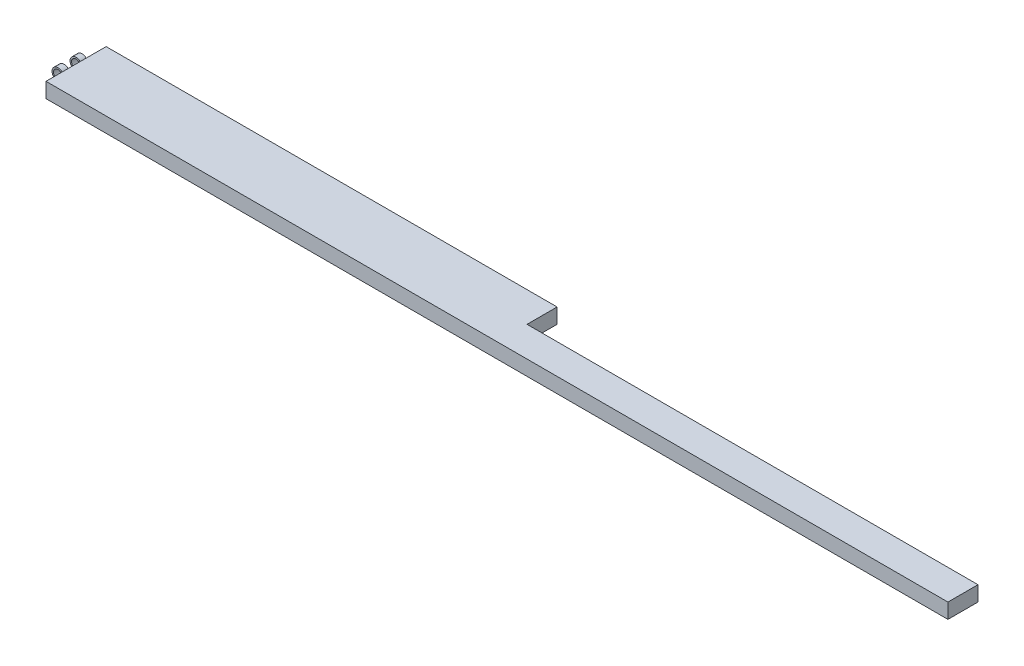
ISO-10303-21;
HEADER;
FILE_DESCRIPTION(('STEP AP214'),'2;1');
FILE_NAME('part.step','',(''),(''),'','','');
FILE_SCHEMA(('AUTOMOTIVE_DESIGN { 1 0 10303 214 1 1 1 1 }'));
ENDSEC;
DATA;
#1=APPLICATION_CONTEXT('core data for automotive mechanical design processes');
#2=APPLICATION_PROTOCOL_DEFINITION('international standard','automotive_design',2000,#1);
#3=PRODUCT_CONTEXT('',#1,'mechanical');
#4=PRODUCT('Part','Part','',(#3));
#5=PRODUCT_RELATED_PRODUCT_CATEGORY('part','',(#4));
#6=PRODUCT_DEFINITION_FORMATION('','',#4);
#7=PRODUCT_DEFINITION_CONTEXT('part definition',#1,'design');
#8=PRODUCT_DEFINITION('design','',#6,#7);
#9=PRODUCT_DEFINITION_SHAPE('','',#8);
#10=(LENGTH_UNIT() NAMED_UNIT(*) SI_UNIT(.MILLI.,.METRE.));
#11=(NAMED_UNIT(*) PLANE_ANGLE_UNIT() SI_UNIT($,.RADIAN.));
#12=(NAMED_UNIT(*) SI_UNIT($,.STERADIAN.) SOLID_ANGLE_UNIT());
#13=UNCERTAINTY_MEASURE_WITH_UNIT(LENGTH_MEASURE(1.E-05),#10,'distance_accuracy_value','');
#14=(GEOMETRIC_REPRESENTATION_CONTEXT(3) GLOBAL_UNCERTAINTY_ASSIGNED_CONTEXT((#13)) GLOBAL_UNIT_ASSIGNED_CONTEXT((#10,
#11,#12)) REPRESENTATION_CONTEXT('',''));
#15=CARTESIAN_POINT('',(0.,0.,0.));
#16=DIRECTION('',(0.,0.,1.));
#17=DIRECTION('',(1.,0.,0.));
#18=AXIS2_PLACEMENT_3D('',#15,#16,#17);
#19=CARTESIAN_POINT('',(-2.54,3.71258824663484,-17.78));
#20=DIRECTION('',(0.,0.,1.));
#21=DIRECTION('',(1.,0.,0.));
#22=AXIS2_PLACEMENT_3D('',#19,#20,#21);
#23=CYLINDRICAL_SURFACE('',#22,2.54);
#24=CARTESIAN_POINT('',(-2.54,3.71258824663484,-10.16));
#25=DIRECTION('',(0.,0.,1.));
#26=DIRECTION('',(1.,0.,0.));
#27=AXIS2_PLACEMENT_3D('',#24,#25,#26);
#28=CIRCLE('',#27,2.54);
#29=CARTESIAN_POINT('',(0.,3.71258824663484,-10.16));
#30=VERTEX_POINT('',#29);
#31=EDGE_CURVE('E56',#30,#30,#28,.T.);
#32=ORIENTED_EDGE('',*,*,#31,.T.);
#33=EDGE_LOOP('',(#32));
#34=FACE_BOUND('',#33,.T.);
#35=CARTESIAN_POINT('',(-2.54,3.71258824663484,-7.62));
#36=DIRECTION('',(0.,0.,1.));
#37=DIRECTION('',(1.,0.,0.));
#38=AXIS2_PLACEMENT_3D('',#35,#36,#37);
#39=CIRCLE('',#38,2.54);
#40=CARTESIAN_POINT('',(0.,3.71258824663484,-7.62));
#41=VERTEX_POINT('',#40);
#42=EDGE_CURVE('E47',#41,#41,#39,.T.);
#43=ORIENTED_EDGE('',*,*,#42,.F.);
#44=EDGE_LOOP('',(#43));
#45=FACE_BOUND('',#44,.T.);
#46=ADVANCED_FACE('F40',(#34,#45),#23,.T.);
#47=CARTESIAN_POINT('',(-2.54,3.71258824663484,-17.78));
#48=DIRECTION('',(0.,0.,1.));
#49=DIRECTION('',(1.,0.,0.));
#50=AXIS2_PLACEMENT_3D('',#47,#48,#49);
#51=CYLINDRICAL_SURFACE('',#50,1.905);
#52=CARTESIAN_POINT('',(-2.54,3.71258824663484,-10.16));
#53=DIRECTION('',(0.,0.,1.));
#54=DIRECTION('',(1.,0.,0.));
#55=AXIS2_PLACEMENT_3D('',#52,#53,#54);
#56=CIRCLE('',#55,1.905);
#57=CARTESIAN_POINT('',(-0.635000000000001,3.71258824663484,-10.16));
#58=VERTEX_POINT('',#57);
#59=EDGE_CURVE('E11',#58,#58,#56,.T.);
#60=ORIENTED_EDGE('',*,*,#59,.F.);
#61=EDGE_LOOP('',(#60));
#62=FACE_BOUND('',#61,.T.);
#63=CARTESIAN_POINT('',(-2.54,3.71258824663484,-7.62));
#64=DIRECTION('',(0.,0.,1.));
#65=DIRECTION('',(1.,0.,0.));
#66=AXIS2_PLACEMENT_3D('',#63,#64,#65);
#67=CIRCLE('',#66,1.905);
#68=CARTESIAN_POINT('',(-0.635000000000001,3.71258824663484,-7.62));
#69=VERTEX_POINT('',#68);
#70=EDGE_CURVE('E51',#69,#69,#67,.T.);
#71=ORIENTED_EDGE('',*,*,#70,.T.);
#72=EDGE_LOOP('',(#71));
#73=FACE_BOUND('',#72,.T.);
#74=ADVANCED_FACE('F42',(#62,#73),#51,.F.);
#75=CARTESIAN_POINT('',(-2.54,3.71258824663484,-7.62));
#76=DIRECTION('',(0.,0.,1.));
#77=DIRECTION('',(1.,0.,0.));
#78=AXIS2_PLACEMENT_3D('',#75,#76,#77);
#79=PLANE('',#78);
#80=ORIENTED_EDGE('',*,*,#42,.T.);
#81=EDGE_LOOP('',(#80));
#82=FACE_BOUND('',#81,.T.);
#83=ORIENTED_EDGE('',*,*,#70,.F.);
#84=EDGE_LOOP('',(#83));
#85=FACE_BOUND('',#84,.T.);
#86=ADVANCED_FACE('F65',(#82,#85),#79,.T.);
#87=CARTESIAN_POINT('',(-2.54,3.71258824663484,-10.16));
#88=DIRECTION('',(0.,0.,1.));
#89=DIRECTION('',(1.,0.,0.));
#90=AXIS2_PLACEMENT_3D('',#87,#88,#89);
#91=PLANE('',#90);
#92=ORIENTED_EDGE('',*,*,#31,.F.);
#93=EDGE_LOOP('',(#92));
#94=FACE_BOUND('',#93,.T.);
#95=ORIENTED_EDGE('',*,*,#59,.T.);
#96=EDGE_LOOP('',(#95));
#97=FACE_BOUND('',#96,.T.);
#98=ADVANCED_FACE('F63',(#94,#97),#91,.F.);
#99=CLOSED_SHELL('',(#46,#74,#86,#98));
#100=MANIFOLD_SOLID_BREP('B2',#99);
#101=CARTESIAN_POINT('',(-2.54,3.71258824663484,-17.78));
#102=DIRECTION('',(0.,0.,1.));
#103=DIRECTION('',(1.,0.,0.));
#104=AXIS2_PLACEMENT_3D('',#101,#102,#103);
#105=CYLINDRICAL_SURFACE('',#104,2.54);
#106=CARTESIAN_POINT('',(-2.54,3.71258824663484,-17.78));
#107=DIRECTION('',(0.,0.,1.));
#108=DIRECTION('',(1.,0.,0.));
#109=AXIS2_PLACEMENT_3D('',#106,#107,#108);
#110=CIRCLE('',#109,2.54);
#111=CARTESIAN_POINT('',(0.,3.71258824663484,-17.78));
#112=VERTEX_POINT('',#111);
#113=EDGE_CURVE('E39',#112,#112,#110,.T.);
#114=ORIENTED_EDGE('',*,*,#113,.T.);
#115=EDGE_LOOP('',(#114));
#116=FACE_BOUND('',#115,.T.);
#117=CARTESIAN_POINT('',(-2.54,3.71258824663484,-15.24));
#118=DIRECTION('',(0.,0.,1.));
#119=DIRECTION('',(1.,0.,0.));
#120=AXIS2_PLACEMENT_3D('',#117,#118,#119);
#121=CIRCLE('',#120,2.54);
#122=CARTESIAN_POINT('',(0.,3.71258824663484,-15.24));
#123=VERTEX_POINT('',#122);
#124=EDGE_CURVE('E121',#123,#123,#121,.T.);
#125=ORIENTED_EDGE('',*,*,#124,.F.);
#126=EDGE_LOOP('',(#125));
#127=FACE_BOUND('',#126,.T.);
#128=ADVANCED_FACE('F111',(#116,#127),#105,.T.);
#129=CARTESIAN_POINT('',(-2.54,3.71258824663484,-17.78));
#130=DIRECTION('',(0.,0.,1.));
#131=DIRECTION('',(1.,0.,0.));
#132=AXIS2_PLACEMENT_3D('',#129,#130,#131);
#133=PLANE('',#132);
#134=CARTESIAN_POINT('',(-2.54,3.71258824663484,-17.78));
#135=DIRECTION('',(0.,0.,1.));
#136=DIRECTION('',(1.,0.,0.));
#137=AXIS2_PLACEMENT_3D('',#134,#135,#136);
#138=CIRCLE('',#137,1.905);
#139=CARTESIAN_POINT('',(-0.635000000000001,3.71258824663484,-17.78));
#140=VERTEX_POINT('',#139);
#141=EDGE_CURVE('E117',#140,#140,#138,.T.);
#142=ORIENTED_EDGE('',*,*,#141,.T.);
#143=EDGE_LOOP('',(#142));
#144=FACE_BOUND('',#143,.T.);
#145=ORIENTED_EDGE('',*,*,#113,.F.);
#146=EDGE_LOOP('',(#145));
#147=FACE_BOUND('',#146,.T.);
#148=ADVANCED_FACE('F140',(#144,#147),#133,.F.);
#149=CARTESIAN_POINT('',(-2.54,3.71258824663484,-17.78));
#150=DIRECTION('',(0.,0.,1.));
#151=DIRECTION('',(1.,0.,0.));
#152=AXIS2_PLACEMENT_3D('',#149,#150,#151);
#153=CYLINDRICAL_SURFACE('',#152,1.905);
#154=ORIENTED_EDGE('',*,*,#141,.F.);
#155=EDGE_LOOP('',(#154));
#156=FACE_BOUND('',#155,.T.);
#157=CARTESIAN_POINT('',(-2.54,3.71258824663484,-15.24));
#158=DIRECTION('',(0.,0.,1.));
#159=DIRECTION('',(1.,0.,0.));
#160=AXIS2_PLACEMENT_3D('',#157,#158,#159);
#161=CIRCLE('',#160,1.905);
#162=CARTESIAN_POINT('',(-0.635000000000001,3.71258824663484,-15.24));
#163=VERTEX_POINT('',#162);
#164=EDGE_CURVE('E125',#163,#163,#161,.T.);
#165=ORIENTED_EDGE('',*,*,#164,.T.);
#166=EDGE_LOOP('',(#165));
#167=FACE_BOUND('',#166,.T.);
#168=ADVANCED_FACE('F131',(#156,#167),#153,.F.);
#169=CARTESIAN_POINT('',(-2.54,3.71258824663484,-15.24));
#170=DIRECTION('',(0.,0.,1.));
#171=DIRECTION('',(1.,0.,0.));
#172=AXIS2_PLACEMENT_3D('',#169,#170,#171);
#173=PLANE('',#172);
#174=ORIENTED_EDGE('',*,*,#164,.F.);
#175=EDGE_LOOP('',(#174));
#176=FACE_BOUND('',#175,.T.);
#177=ORIENTED_EDGE('',*,*,#124,.T.);
#178=EDGE_LOOP('',(#177));
#179=FACE_BOUND('',#178,.T.);
#180=ADVANCED_FACE('F133',(#176,#179),#173,.T.);
#181=CLOSED_SHELL('',(#128,#148,#168,#180));
#182=MANIFOLD_SOLID_BREP('B6',#181);
#183=CARTESIAN_POINT('',(0.,6.35,0.));
#184=DIRECTION('',(1.,0.,0.));
#185=DIRECTION('',(0.,0.,-1.));
#186=AXIS2_PLACEMENT_3D('',#183,#184,#185);
#187=PLANE('',#186);
#188=DIRECTION('',(0.,0.,1.));
#189=VECTOR('',#188,1.);
#190=CARTESIAN_POINT('',(0.,0.,0.));
#191=LINE('',#190,#189);
#192=CARTESIAN_POINT('',(0.,0.,-25.4));
#193=VERTEX_POINT('',#192);
#194=CARTESIAN_POINT('',(0.,0.,0.));
#195=VERTEX_POINT('',#194);
#196=EDGE_CURVE('E257',#193,#195,#191,.T.);
#197=ORIENTED_EDGE('',*,*,#196,.T.);
#198=DIRECTION('',(0.,-1.,0.));
#199=VECTOR('',#198,1.);
#200=CARTESIAN_POINT('',(0.,6.35,0.));
#201=LINE('',#200,#199);
#202=CARTESIAN_POINT('',(0.,6.35,0.));
#203=VERTEX_POINT('',#202);
#204=EDGE_CURVE('E109',#203,#195,#201,.T.);
#205=ORIENTED_EDGE('',*,*,#204,.F.);
#206=DIRECTION('',(0.,0.,1.));
#207=VECTOR('',#206,1.);
#208=CARTESIAN_POINT('',(0.,6.35,0.));
#209=LINE('',#208,#207);
#210=CARTESIAN_POINT('',(0.,6.35,-25.4));
#211=VERTEX_POINT('',#210);
#212=EDGE_CURVE('E267',#211,#203,#209,.T.);
#213=ORIENTED_EDGE('',*,*,#212,.F.);
#214=DIRECTION('',(0.,-1.,0.));
#215=VECTOR('',#214,1.);
#216=CARTESIAN_POINT('',(0.,6.35,-25.4));
#217=LINE('',#216,#215);
#218=EDGE_CURVE('E253',#211,#193,#217,.T.);
#219=ORIENTED_EDGE('',*,*,#218,.T.);
#220=EDGE_LOOP('',(#197,#205,#213,#219));
#221=FACE_BOUND('',#220,.T.);
#222=ADVANCED_FACE('F173',(#221),#187,.F.);
#223=CARTESIAN_POINT('',(0.,6.35,0.));
#224=DIRECTION('',(0.,0.,-1.));
#225=DIRECTION('',(-1.,0.,0.));
#226=AXIS2_PLACEMENT_3D('',#223,#224,#225);
#227=PLANE('',#226);
#228=DIRECTION('',(1.,0.,0.));
#229=VECTOR('',#228,1.);
#230=CARTESIAN_POINT('',(0.,0.,0.));
#231=LINE('',#230,#229);
#232=CARTESIAN_POINT('',(381.,0.,0.));
#233=VERTEX_POINT('',#232);
#234=EDGE_CURVE('E260',#195,#233,#231,.T.);
#235=ORIENTED_EDGE('',*,*,#234,.T.);
#236=DIRECTION('',(0.,-1.,0.));
#237=VECTOR('',#236,1.);
#238=CARTESIAN_POINT('',(381.,6.35,0.));
#239=LINE('',#238,#237);
#240=CARTESIAN_POINT('',(381.,6.35,0.));
#241=VERTEX_POINT('',#240);
#242=EDGE_CURVE('E181',#241,#233,#239,.T.);
#243=ORIENTED_EDGE('',*,*,#242,.F.);
#244=DIRECTION('',(1.,0.,0.));
#245=VECTOR('',#244,1.);
#246=CARTESIAN_POINT('',(0.,6.35,0.));
#247=LINE('',#246,#245);
#248=EDGE_CURVE('E226',#203,#241,#247,.T.);
#249=ORIENTED_EDGE('',*,*,#248,.F.);
#250=ORIENTED_EDGE('',*,*,#204,.T.);
#251=EDGE_LOOP('',(#235,#243,#249,#250));
#252=FACE_BOUND('',#251,.T.);
#253=ADVANCED_FACE('F291',(#252),#227,.F.);
#254=CARTESIAN_POINT('',(381.,6.35,0.));
#255=DIRECTION('',(-1.,0.,0.));
#256=DIRECTION('',(0.,0.,1.));
#257=AXIS2_PLACEMENT_3D('',#254,#255,#256);
#258=PLANE('',#257);
#259=DIRECTION('',(0.,0.,-1.));
#260=VECTOR('',#259,1.);
#261=CARTESIAN_POINT('',(381.,0.,0.));
#262=LINE('',#261,#260);
#263=CARTESIAN_POINT('',(381.,0.,-12.7));
#264=VERTEX_POINT('',#263);
#265=EDGE_CURVE('E262',#233,#264,#262,.T.);
#266=ORIENTED_EDGE('',*,*,#265,.T.);
#267=DIRECTION('',(0.,-1.,0.));
#268=VECTOR('',#267,1.);
#269=CARTESIAN_POINT('',(381.,6.35,-12.7));
#270=LINE('',#269,#268);
#271=CARTESIAN_POINT('',(381.,6.35,-12.7));
#272=VERTEX_POINT('',#271);
#273=EDGE_CURVE('E248',#272,#264,#270,.T.);
#274=ORIENTED_EDGE('',*,*,#273,.F.);
#275=DIRECTION('',(0.,0.,-1.));
#276=VECTOR('',#275,1.);
#277=CARTESIAN_POINT('',(381.,6.35,0.));
#278=LINE('',#277,#276);
#279=EDGE_CURVE('E239',#241,#272,#278,.T.);
#280=ORIENTED_EDGE('',*,*,#279,.F.);
#281=ORIENTED_EDGE('',*,*,#242,.T.);
#282=EDGE_LOOP('',(#266,#274,#280,#281));
#283=FACE_BOUND('',#282,.T.);
#284=ADVANCED_FACE('F273',(#283),#258,.F.);
#285=CARTESIAN_POINT('',(190.5,6.35,-12.7));
#286=DIRECTION('',(0.,0.,1.));
#287=DIRECTION('',(1.,0.,0.));
#288=AXIS2_PLACEMENT_3D('',#285,#286,#287);
#289=PLANE('',#288);
#290=DIRECTION('',(-1.,0.,0.));
#291=VECTOR('',#290,1.);
#292=CARTESIAN_POINT('',(190.5,0.,-12.7));
#293=LINE('',#292,#291);
#294=CARTESIAN_POINT('',(190.5,0.,-12.7));
#295=VERTEX_POINT('',#294);
#296=EDGE_CURVE('E247',#264,#295,#293,.T.);
#297=ORIENTED_EDGE('',*,*,#296,.T.);
#298=DIRECTION('',(0.,-1.,0.));
#299=VECTOR('',#298,1.);
#300=CARTESIAN_POINT('',(190.5,6.35,-12.7));
#301=LINE('',#300,#299);
#302=CARTESIAN_POINT('',(190.5,6.35,-12.7));
#303=VERTEX_POINT('',#302);
#304=EDGE_CURVE('E244',#303,#295,#301,.T.);
#305=ORIENTED_EDGE('',*,*,#304,.F.);
#306=DIRECTION('',(-1.,0.,0.));
#307=VECTOR('',#306,1.);
#308=CARTESIAN_POINT('',(190.5,6.35,-12.7));
#309=LINE('',#308,#307);
#310=EDGE_CURVE('E233',#272,#303,#309,.T.);
#311=ORIENTED_EDGE('',*,*,#310,.F.);
#312=ORIENTED_EDGE('',*,*,#273,.T.);
#313=EDGE_LOOP('',(#297,#305,#311,#312));
#314=FACE_BOUND('',#313,.T.);
#315=ADVANCED_FACE('F245',(#314),#289,.F.);
#316=CARTESIAN_POINT('',(190.5,6.35,-25.4));
#317=DIRECTION('',(-1.,0.,0.));
#318=DIRECTION('',(0.,0.,1.));
#319=AXIS2_PLACEMENT_3D('',#316,#317,#318);
#320=PLANE('',#319);
#321=DIRECTION('',(0.,0.,-1.));
#322=VECTOR('',#321,1.);
#323=CARTESIAN_POINT('',(190.5,0.,-25.4));
#324=LINE('',#323,#322);
#325=CARTESIAN_POINT('',(190.5,0.,-25.4));
#326=VERTEX_POINT('',#325);
#327=EDGE_CURVE('E212',#295,#326,#324,.T.);
#328=ORIENTED_EDGE('',*,*,#327,.T.);
#329=DIRECTION('',(0.,-1.,0.));
#330=VECTOR('',#329,1.);
#331=CARTESIAN_POINT('',(190.5,6.35,-25.4));
#332=LINE('',#331,#330);
#333=CARTESIAN_POINT('',(190.5,6.35,-25.4));
#334=VERTEX_POINT('',#333);
#335=EDGE_CURVE('E249',#334,#326,#332,.T.);
#336=ORIENTED_EDGE('',*,*,#335,.F.);
#337=DIRECTION('',(0.,0.,-1.));
#338=VECTOR('',#337,1.);
#339=CARTESIAN_POINT('',(190.5,6.35,-25.4));
#340=LINE('',#339,#338);
#341=EDGE_CURVE('E237',#303,#334,#340,.T.);
#342=ORIENTED_EDGE('',*,*,#341,.F.);
#343=ORIENTED_EDGE('',*,*,#304,.T.);
#344=EDGE_LOOP('',(#328,#336,#342,#343));
#345=FACE_BOUND('',#344,.T.);
#346=ADVANCED_FACE('F251',(#345),#320,.F.);
#347=CARTESIAN_POINT('',(0.,6.35,-25.4));
#348=DIRECTION('',(0.,0.,1.));
#349=DIRECTION('',(1.,0.,0.));
#350=AXIS2_PLACEMENT_3D('',#347,#348,#349);
#351=PLANE('',#350);
#352=DIRECTION('',(-1.,0.,0.));
#353=VECTOR('',#352,1.);
#354=CARTESIAN_POINT('',(0.,0.,-25.4));
#355=LINE('',#354,#353);
#356=EDGE_CURVE('E218',#326,#193,#355,.T.);
#357=ORIENTED_EDGE('',*,*,#356,.T.);
#358=ORIENTED_EDGE('',*,*,#218,.F.);
#359=DIRECTION('',(-1.,0.,0.));
#360=VECTOR('',#359,1.);
#361=CARTESIAN_POINT('',(0.,6.35,-25.4));
#362=LINE('',#361,#360);
#363=EDGE_CURVE('E189',#334,#211,#362,.T.);
#364=ORIENTED_EDGE('',*,*,#363,.F.);
#365=ORIENTED_EDGE('',*,*,#335,.T.);
#366=EDGE_LOOP('',(#357,#358,#364,#365));
#367=FACE_BOUND('',#366,.T.);
#368=ADVANCED_FACE('F280',(#367),#351,.F.);
#369=CARTESIAN_POINT('',(0.,6.35,0.));
#370=DIRECTION('',(0.,-1.,0.));
#371=DIRECTION('',(0.,0.,-1.));
#372=AXIS2_PLACEMENT_3D('',#369,#370,#371);
#373=PLANE('',#372);
#374=ORIENTED_EDGE('',*,*,#212,.T.);
#375=ORIENTED_EDGE('',*,*,#248,.T.);
#376=ORIENTED_EDGE('',*,*,#279,.T.);
#377=ORIENTED_EDGE('',*,*,#310,.T.);
#378=ORIENTED_EDGE('',*,*,#341,.T.);
#379=ORIENTED_EDGE('',*,*,#363,.T.);
#380=EDGE_LOOP('',(#374,#375,#376,#377,#378,#379));
#381=FACE_BOUND('',#380,.T.);
#382=ADVANCED_FACE('F235',(#381),#373,.F.);
#383=CARTESIAN_POINT('',(0.,0.,0.));
#384=DIRECTION('',(0.,-1.,0.));
#385=DIRECTION('',(0.,0.,-1.));
#386=AXIS2_PLACEMENT_3D('',#383,#384,#385);
#387=PLANE('',#386);
#388=ORIENTED_EDGE('',*,*,#196,.F.);
#389=ORIENTED_EDGE('',*,*,#356,.F.);
#390=ORIENTED_EDGE('',*,*,#327,.F.);
#391=ORIENTED_EDGE('',*,*,#296,.F.);
#392=ORIENTED_EDGE('',*,*,#265,.F.);
#393=ORIENTED_EDGE('',*,*,#234,.F.);
#394=EDGE_LOOP('',(#388,#389,#390,#391,#392,#393));
#395=FACE_BOUND('',#394,.T.);
#396=ADVANCED_FACE('F276',(#395),#387,.T.);
#397=CLOSED_SHELL('',(#222,#253,#284,#315,#346,#368,#382,#396));
#398=MANIFOLD_SOLID_BREP('B34',#397);
#399=ADVANCED_BREP_SHAPE_REPRESENTATION('',(#18,#100,#182,#398),#14);
#400=SHAPE_DEFINITION_REPRESENTATION(#9,#399);
ENDSEC;
END-ISO-10303-21;
